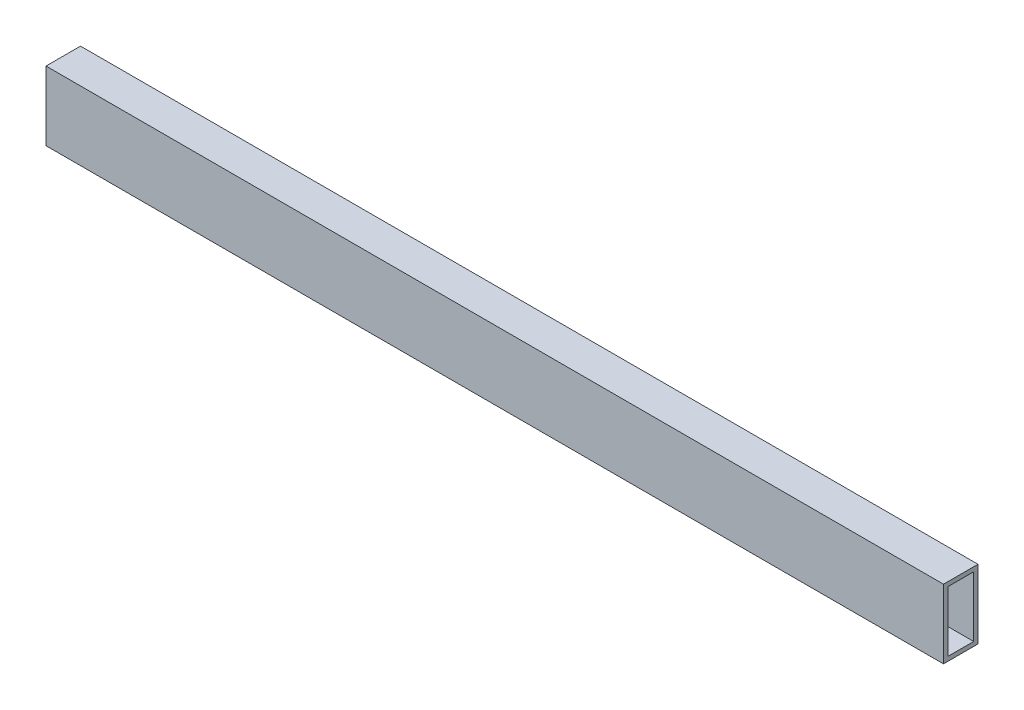
ISO-10303-21;
HEADER;
FILE_DESCRIPTION(('STEP AP214'),'2;1');
FILE_NAME('part.step','',(''),(''),'','','');
FILE_SCHEMA(('AUTOMOTIVE_DESIGN { 1 0 10303 214 1 1 1 1 }'));
ENDSEC;
DATA;
#1=APPLICATION_CONTEXT('core data for automotive mechanical design processes');
#2=APPLICATION_PROTOCOL_DEFINITION('international standard','automotive_design',2000,#1);
#3=PRODUCT_CONTEXT('',#1,'mechanical');
#4=PRODUCT('Part','Part','',(#3));
#5=PRODUCT_RELATED_PRODUCT_CATEGORY('part','',(#4));
#6=PRODUCT_DEFINITION_FORMATION('','',#4);
#7=PRODUCT_DEFINITION_CONTEXT('part definition',#1,'design');
#8=PRODUCT_DEFINITION('design','',#6,#7);
#9=PRODUCT_DEFINITION_SHAPE('','',#8);
#10=(LENGTH_UNIT() NAMED_UNIT(*) SI_UNIT(.MILLI.,.METRE.));
#11=(NAMED_UNIT(*) PLANE_ANGLE_UNIT() SI_UNIT($,.RADIAN.));
#12=(NAMED_UNIT(*) SI_UNIT($,.STERADIAN.) SOLID_ANGLE_UNIT());
#13=UNCERTAINTY_MEASURE_WITH_UNIT(LENGTH_MEASURE(1.E-05),#10,'distance_accuracy_value','');
#14=(GEOMETRIC_REPRESENTATION_CONTEXT(3) GLOBAL_UNCERTAINTY_ASSIGNED_CONTEXT((#13)) GLOBAL_UNIT_ASSIGNED_CONTEXT((#10,
#11,#12)) REPRESENTATION_CONTEXT('',''));
#15=CARTESIAN_POINT('',(0.,0.,0.));
#16=DIRECTION('',(0.,0.,1.));
#17=DIRECTION('',(1.,0.,0.));
#18=AXIS2_PLACEMENT_3D('',#15,#16,#17);
#19=CARTESIAN_POINT('',(330.2,0.,0.));
#20=DIRECTION('',(1.,0.,0.));
#21=DIRECTION('',(0.,0.,-1.));
#22=AXIS2_PLACEMENT_3D('',#19,#20,#21);
#23=PLANE('',#22);
#24=DIRECTION('',(0.,1.,0.));
#25=VECTOR('',#24,1.);
#26=CARTESIAN_POINT('',(330.2,-25.4,355.6));
#27=LINE('',#26,#25);
#28=CARTESIAN_POINT('',(330.2,-25.4,355.6));
#29=VERTEX_POINT('',#28);
#30=CARTESIAN_POINT('',(330.2,25.4,355.6));
#31=VERTEX_POINT('',#30);
#32=EDGE_CURVE('E152',#29,#31,#27,.T.);
#33=ORIENTED_EDGE('',*,*,#32,.T.);
#34=DIRECTION('',(0.,0.,1.));
#35=VECTOR('',#34,1.);
#36=CARTESIAN_POINT('',(330.2,25.4,355.6));
#37=LINE('',#36,#35);
#38=CARTESIAN_POINT('',(330.2,25.4,381.));
#39=VERTEX_POINT('',#38);
#40=EDGE_CURVE('E154',#31,#39,#37,.T.);
#41=ORIENTED_EDGE('',*,*,#40,.T.);
#42=DIRECTION('',(0.,-1.,0.));
#43=VECTOR('',#42,1.);
#44=CARTESIAN_POINT('',(330.2,-25.4,381.));
#45=LINE('',#44,#43);
#46=CARTESIAN_POINT('',(330.2,-25.4,381.));
#47=VERTEX_POINT('',#46);
#48=EDGE_CURVE('E156',#39,#47,#45,.T.);
#49=ORIENTED_EDGE('',*,*,#48,.T.);
#50=DIRECTION('',(0.,0.,-1.));
#51=VECTOR('',#50,1.);
#52=CARTESIAN_POINT('',(330.2,-25.4,355.6));
#53=LINE('',#52,#51);
#54=EDGE_CURVE('E60',#47,#29,#53,.T.);
#55=ORIENTED_EDGE('',*,*,#54,.T.);
#56=EDGE_LOOP('',(#33,#41,#49,#55));
#57=FACE_BOUND('',#56,.T.);
#58=DIRECTION('',(0.,0.,1.));
#59=VECTOR('',#58,1.);
#60=CARTESIAN_POINT('',(330.2,22.225,358.775));
#61=LINE('',#60,#59);
#62=CARTESIAN_POINT('',(330.2,22.225,358.775));
#63=VERTEX_POINT('',#62);
#64=CARTESIAN_POINT('',(330.2,22.225,377.825));
#65=VERTEX_POINT('',#64);
#66=EDGE_CURVE('E143',#63,#65,#61,.T.);
#67=ORIENTED_EDGE('',*,*,#66,.F.);
#68=DIRECTION('',(0.,1.,0.));
#69=VECTOR('',#68,1.);
#70=CARTESIAN_POINT('',(330.2,-22.225,358.775));
#71=LINE('',#70,#69);
#72=CARTESIAN_POINT('',(330.2,-22.225,358.775));
#73=VERTEX_POINT('',#72);
#74=EDGE_CURVE('E141',#73,#63,#71,.T.);
#75=ORIENTED_EDGE('',*,*,#74,.F.);
#76=DIRECTION('',(0.,0.,-1.));
#77=VECTOR('',#76,1.);
#78=CARTESIAN_POINT('',(330.2,-22.225,358.775));
#79=LINE('',#78,#77);
#80=CARTESIAN_POINT('',(330.2,-22.225,377.825));
#81=VERTEX_POINT('',#80);
#82=EDGE_CURVE('E107',#81,#73,#79,.T.);
#83=ORIENTED_EDGE('',*,*,#82,.F.);
#84=DIRECTION('',(0.,-1.,0.));
#85=VECTOR('',#84,1.);
#86=CARTESIAN_POINT('',(330.2,-22.225,377.825));
#87=LINE('',#86,#85);
#88=EDGE_CURVE('E145',#65,#81,#87,.T.);
#89=ORIENTED_EDGE('',*,*,#88,.F.);
#90=EDGE_LOOP('',(#67,#75,#83,#89));
#91=FACE_BOUND('',#90,.T.);
#92=ADVANCED_FACE('F37',(#57,#91),#23,.T.);
#93=CARTESIAN_POINT('',(330.2,-25.4,355.6));
#94=DIRECTION('',(0.,0.,1.));
#95=DIRECTION('',(1.,0.,0.));
#96=AXIS2_PLACEMENT_3D('',#93,#94,#95);
#97=PLANE('',#96);
#98=DIRECTION('',(-1.,0.,0.));
#99=VECTOR('',#98,1.);
#100=CARTESIAN_POINT('',(330.2,-25.4,355.6));
#101=LINE('',#100,#99);
#102=CARTESIAN_POINT('',(-330.2,-25.4,355.6));
#103=VERTEX_POINT('',#102);
#104=EDGE_CURVE('E159',#29,#103,#101,.T.);
#105=ORIENTED_EDGE('',*,*,#104,.T.);
#106=DIRECTION('',(0.,1.,0.));
#107=VECTOR('',#106,1.);
#108=CARTESIAN_POINT('',(-330.2,-25.4,355.6));
#109=LINE('',#108,#107);
#110=CARTESIAN_POINT('',(-330.2,25.4,355.6));
#111=VERTEX_POINT('',#110);
#112=EDGE_CURVE('E129',#103,#111,#109,.T.);
#113=ORIENTED_EDGE('',*,*,#112,.T.);
#114=DIRECTION('',(-1.,0.,0.));
#115=VECTOR('',#114,1.);
#116=CARTESIAN_POINT('',(330.2,25.4,355.6));
#117=LINE('',#116,#115);
#118=EDGE_CURVE('E11',#31,#111,#117,.T.);
#119=ORIENTED_EDGE('',*,*,#118,.F.);
#120=ORIENTED_EDGE('',*,*,#32,.F.);
#121=EDGE_LOOP('',(#105,#113,#119,#120));
#122=FACE_BOUND('',#121,.T.);
#123=ADVANCED_FACE('F39',(#122),#97,.F.);
#124=CARTESIAN_POINT('',(330.2,25.4,355.6));
#125=DIRECTION('',(0.,-1.,0.));
#126=DIRECTION('',(0.,0.,-1.));
#127=AXIS2_PLACEMENT_3D('',#124,#125,#126);
#128=PLANE('',#127);
#129=ORIENTED_EDGE('',*,*,#118,.T.);
#130=DIRECTION('',(0.,0.,1.));
#131=VECTOR('',#130,1.);
#132=CARTESIAN_POINT('',(-330.2,25.4,355.6));
#133=LINE('',#132,#131);
#134=CARTESIAN_POINT('',(-330.2,25.4,381.));
#135=VERTEX_POINT('',#134);
#136=EDGE_CURVE('E138',#111,#135,#133,.T.);
#137=ORIENTED_EDGE('',*,*,#136,.T.);
#138=DIRECTION('',(-1.,0.,0.));
#139=VECTOR('',#138,1.);
#140=CARTESIAN_POINT('',(330.2,25.4,381.));
#141=LINE('',#140,#139);
#142=EDGE_CURVE('E45',#39,#135,#141,.T.);
#143=ORIENTED_EDGE('',*,*,#142,.F.);
#144=ORIENTED_EDGE('',*,*,#40,.F.);
#145=EDGE_LOOP('',(#129,#137,#143,#144));
#146=FACE_BOUND('',#145,.T.);
#147=ADVANCED_FACE('F172',(#146),#128,.F.);
#148=CARTESIAN_POINT('',(330.2,-25.4,381.));
#149=DIRECTION('',(0.,0.,-1.));
#150=DIRECTION('',(-1.,0.,0.));
#151=AXIS2_PLACEMENT_3D('',#148,#149,#150);
#152=PLANE('',#151);
#153=ORIENTED_EDGE('',*,*,#142,.T.);
#154=DIRECTION('',(0.,-1.,0.));
#155=VECTOR('',#154,1.);
#156=CARTESIAN_POINT('',(-330.2,-25.4,381.));
#157=LINE('',#156,#155);
#158=CARTESIAN_POINT('',(-330.2,-25.4,381.));
#159=VERTEX_POINT('',#158);
#160=EDGE_CURVE('E135',#135,#159,#157,.T.);
#161=ORIENTED_EDGE('',*,*,#160,.T.);
#162=DIRECTION('',(-1.,0.,0.));
#163=VECTOR('',#162,1.);
#164=CARTESIAN_POINT('',(330.2,-25.4,381.));
#165=LINE('',#164,#163);
#166=EDGE_CURVE('E161',#47,#159,#165,.T.);
#167=ORIENTED_EDGE('',*,*,#166,.F.);
#168=ORIENTED_EDGE('',*,*,#48,.F.);
#169=EDGE_LOOP('',(#153,#161,#167,#168));
#170=FACE_BOUND('',#169,.T.);
#171=ADVANCED_FACE('F166',(#170),#152,.F.);
#172=CARTESIAN_POINT('',(330.2,-25.4,355.6));
#173=DIRECTION('',(0.,1.,0.));
#174=DIRECTION('',(0.,0.,1.));
#175=AXIS2_PLACEMENT_3D('',#172,#173,#174);
#176=PLANE('',#175);
#177=ORIENTED_EDGE('',*,*,#166,.T.);
#178=DIRECTION('',(0.,0.,-1.));
#179=VECTOR('',#178,1.);
#180=CARTESIAN_POINT('',(-330.2,-25.4,355.6));
#181=LINE('',#180,#179);
#182=EDGE_CURVE('E132',#159,#103,#181,.T.);
#183=ORIENTED_EDGE('',*,*,#182,.T.);
#184=ORIENTED_EDGE('',*,*,#104,.F.);
#185=ORIENTED_EDGE('',*,*,#54,.F.);
#186=EDGE_LOOP('',(#177,#183,#184,#185));
#187=FACE_BOUND('',#186,.T.);
#188=ADVANCED_FACE('F177',(#187),#176,.F.);
#189=CARTESIAN_POINT('',(330.2,-22.225,358.775));
#190=DIRECTION('',(0.,0.,1.));
#191=DIRECTION('',(1.,0.,0.));
#192=AXIS2_PLACEMENT_3D('',#189,#190,#191);
#193=PLANE('',#192);
#194=DIRECTION('',(-1.,0.,0.));
#195=VECTOR('',#194,1.);
#196=CARTESIAN_POINT('',(330.2,22.225,358.775));
#197=LINE('',#196,#195);
#198=CARTESIAN_POINT('',(-330.2,22.225,358.775));
#199=VERTEX_POINT('',#198);
#200=EDGE_CURVE('E115',#63,#199,#197,.T.);
#201=ORIENTED_EDGE('',*,*,#200,.T.);
#202=DIRECTION('',(0.,1.,0.));
#203=VECTOR('',#202,1.);
#204=CARTESIAN_POINT('',(-330.2,-22.225,358.775));
#205=LINE('',#204,#203);
#206=CARTESIAN_POINT('',(-330.2,-22.225,358.775));
#207=VERTEX_POINT('',#206);
#208=EDGE_CURVE('E112',#207,#199,#205,.T.);
#209=ORIENTED_EDGE('',*,*,#208,.F.);
#210=DIRECTION('',(-1.,0.,0.));
#211=VECTOR('',#210,1.);
#212=CARTESIAN_POINT('',(330.2,-22.225,358.775));
#213=LINE('',#212,#211);
#214=EDGE_CURVE('E100',#73,#207,#213,.T.);
#215=ORIENTED_EDGE('',*,*,#214,.F.);
#216=ORIENTED_EDGE('',*,*,#74,.T.);
#217=EDGE_LOOP('',(#201,#209,#215,#216));
#218=FACE_BOUND('',#217,.T.);
#219=ADVANCED_FACE('F113',(#218),#193,.T.);
#220=CARTESIAN_POINT('',(330.2,22.225,358.775));
#221=DIRECTION('',(0.,-1.,0.));
#222=DIRECTION('',(0.,0.,-1.));
#223=AXIS2_PLACEMENT_3D('',#220,#221,#222);
#224=PLANE('',#223);
#225=DIRECTION('',(-1.,0.,0.));
#226=VECTOR('',#225,1.);
#227=CARTESIAN_POINT('',(330.2,22.225,377.825));
#228=LINE('',#227,#226);
#229=CARTESIAN_POINT('',(-330.2,22.225,377.825));
#230=VERTEX_POINT('',#229);
#231=EDGE_CURVE('E149',#65,#230,#228,.T.);
#232=ORIENTED_EDGE('',*,*,#231,.T.);
#233=DIRECTION('',(0.,0.,1.));
#234=VECTOR('',#233,1.);
#235=CARTESIAN_POINT('',(-330.2,22.225,358.775));
#236=LINE('',#235,#234);
#237=EDGE_CURVE('E125',#199,#230,#236,.T.);
#238=ORIENTED_EDGE('',*,*,#237,.F.);
#239=ORIENTED_EDGE('',*,*,#200,.F.);
#240=ORIENTED_EDGE('',*,*,#66,.T.);
#241=EDGE_LOOP('',(#232,#238,#239,#240));
#242=FACE_BOUND('',#241,.T.);
#243=ADVANCED_FACE('F185',(#242),#224,.T.);
#244=CARTESIAN_POINT('',(330.2,-22.225,377.825));
#245=DIRECTION('',(0.,0.,-1.));
#246=DIRECTION('',(-1.,0.,0.));
#247=AXIS2_PLACEMENT_3D('',#244,#245,#246);
#248=PLANE('',#247);
#249=DIRECTION('',(-1.,0.,0.));
#250=VECTOR('',#249,1.);
#251=CARTESIAN_POINT('',(330.2,-22.225,377.825));
#252=LINE('',#251,#250);
#253=CARTESIAN_POINT('',(-330.2,-22.225,377.825));
#254=VERTEX_POINT('',#253);
#255=EDGE_CURVE('E52',#81,#254,#252,.T.);
#256=ORIENTED_EDGE('',*,*,#255,.T.);
#257=DIRECTION('',(0.,-1.,0.));
#258=VECTOR('',#257,1.);
#259=CARTESIAN_POINT('',(-330.2,-22.225,377.825));
#260=LINE('',#259,#258);
#261=EDGE_CURVE('E123',#230,#254,#260,.T.);
#262=ORIENTED_EDGE('',*,*,#261,.F.);
#263=ORIENTED_EDGE('',*,*,#231,.F.);
#264=ORIENTED_EDGE('',*,*,#88,.T.);
#265=EDGE_LOOP('',(#256,#262,#263,#264));
#266=FACE_BOUND('',#265,.T.);
#267=ADVANCED_FACE('F187',(#266),#248,.T.);
#268=CARTESIAN_POINT('',(330.2,-22.225,358.775));
#269=DIRECTION('',(0.,1.,0.));
#270=DIRECTION('',(0.,0.,1.));
#271=AXIS2_PLACEMENT_3D('',#268,#269,#270);
#272=PLANE('',#271);
#273=ORIENTED_EDGE('',*,*,#214,.T.);
#274=DIRECTION('',(0.,0.,-1.));
#275=VECTOR('',#274,1.);
#276=CARTESIAN_POINT('',(-330.2,-22.225,358.775));
#277=LINE('',#276,#275);
#278=EDGE_CURVE('E104',#254,#207,#277,.T.);
#279=ORIENTED_EDGE('',*,*,#278,.F.);
#280=ORIENTED_EDGE('',*,*,#255,.F.);
#281=ORIENTED_EDGE('',*,*,#82,.T.);
#282=EDGE_LOOP('',(#273,#279,#280,#281));
#283=FACE_BOUND('',#282,.T.);
#284=ADVANCED_FACE('F102',(#283),#272,.T.);
#285=CARTESIAN_POINT('',(-330.2,0.,0.));
#286=DIRECTION('',(-1.,0.,0.));
#287=DIRECTION('',(0.,0.,-1.));
#288=AXIS2_PLACEMENT_3D('',#285,#286,#287);
#289=PLANE('',#288);
#290=ORIENTED_EDGE('',*,*,#208,.T.);
#291=ORIENTED_EDGE('',*,*,#237,.T.);
#292=ORIENTED_EDGE('',*,*,#261,.T.);
#293=ORIENTED_EDGE('',*,*,#278,.T.);
#294=EDGE_LOOP('',(#290,#291,#292,#293));
#295=FACE_BOUND('',#294,.T.);
#296=ORIENTED_EDGE('',*,*,#112,.F.);
#297=ORIENTED_EDGE('',*,*,#182,.F.);
#298=ORIENTED_EDGE('',*,*,#160,.F.);
#299=ORIENTED_EDGE('',*,*,#136,.F.);
#300=EDGE_LOOP('',(#296,#297,#298,#299));
#301=FACE_BOUND('',#300,.T.);
#302=ADVANCED_FACE('F120',(#295,#301),#289,.T.);
#303=CLOSED_SHELL('',(#92,#123,#147,#171,#188,#219,#243,#267,#284,#302));
#304=MANIFOLD_SOLID_BREP('B2',#303);
#305=ADVANCED_BREP_SHAPE_REPRESENTATION('',(#18,#304),#14);
#306=SHAPE_DEFINITION_REPRESENTATION(#9,#305);
ENDSEC;
END-ISO-10303-21;
